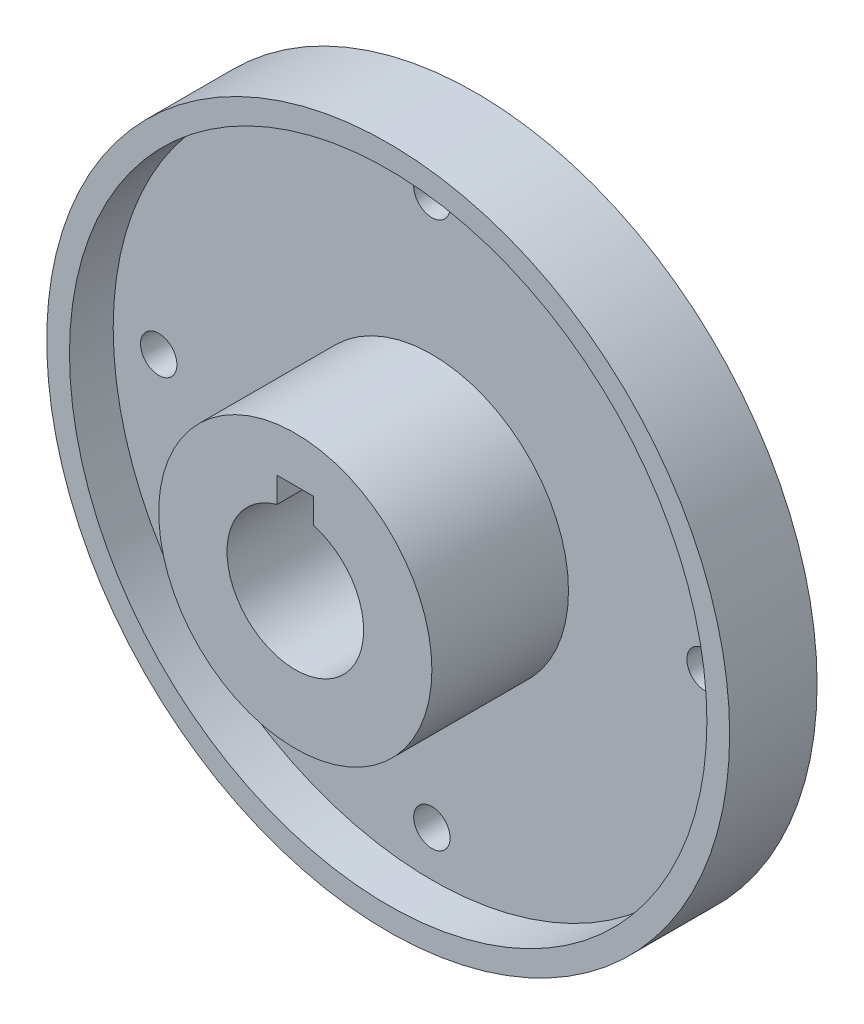
ISO-10303-21;
HEADER;
FILE_DESCRIPTION(('STEP AP214'),'2;1');
FILE_NAME('part.step','',(''),(''),'','','');
FILE_SCHEMA(('AUTOMOTIVE_DESIGN { 1 0 10303 214 1 1 1 1 }'));
ENDSEC;
DATA;
#1=APPLICATION_CONTEXT('core data for automotive mechanical design processes');
#2=APPLICATION_PROTOCOL_DEFINITION('international standard','automotive_design',2000,#1);
#3=PRODUCT_CONTEXT('',#1,'mechanical');
#4=PRODUCT('Part','Part','',(#3));
#5=PRODUCT_RELATED_PRODUCT_CATEGORY('part','',(#4));
#6=PRODUCT_DEFINITION_FORMATION('','',#4);
#7=PRODUCT_DEFINITION_CONTEXT('part definition',#1,'design');
#8=PRODUCT_DEFINITION('design','',#6,#7);
#9=PRODUCT_DEFINITION_SHAPE('','',#8);
#10=(LENGTH_UNIT() NAMED_UNIT(*) SI_UNIT(.MILLI.,.METRE.));
#11=(NAMED_UNIT(*) PLANE_ANGLE_UNIT() SI_UNIT($,.RADIAN.));
#12=(NAMED_UNIT(*) SI_UNIT($,.STERADIAN.) SOLID_ANGLE_UNIT());
#13=UNCERTAINTY_MEASURE_WITH_UNIT(LENGTH_MEASURE(1.E-05),#10,'distance_accuracy_value','');
#14=(GEOMETRIC_REPRESENTATION_CONTEXT(3) GLOBAL_UNCERTAINTY_ASSIGNED_CONTEXT((#13)) GLOBAL_UNIT_ASSIGNED_CONTEXT((#10,
#11,#12)) REPRESENTATION_CONTEXT('',''));
#15=CARTESIAN_POINT('',(0.,0.,0.));
#16=DIRECTION('',(0.,0.,1.));
#17=DIRECTION('',(1.,0.,0.));
#18=AXIS2_PLACEMENT_3D('',#15,#16,#17);
#19=CARTESIAN_POINT('',(0.,0.,19.2));
#20=DIRECTION('',(0.,0.,-1.));
#21=DIRECTION('',(-1.,0.,0.));
#22=AXIS2_PLACEMENT_3D('',#19,#20,#21);
#23=CYLINDRICAL_SURFACE('',#22,75.);
#24=CARTESIAN_POINT('',(0.,0.,19.2));
#25=DIRECTION('',(0.,0.,1.));
#26=DIRECTION('',(1.,0.,0.));
#27=AXIS2_PLACEMENT_3D('',#24,#25,#26);
#28=CIRCLE('',#27,75.);
#29=CARTESIAN_POINT('',(75.,0.,19.2));
#30=VERTEX_POINT('',#29);
#31=EDGE_CURVE('E175',#30,#30,#28,.T.);
#32=ORIENTED_EDGE('',*,*,#31,.F.);
#33=EDGE_LOOP('',(#32));
#34=FACE_BOUND('',#33,.T.);
#35=CARTESIAN_POINT('',(0.,0.,0.));
#36=DIRECTION('',(0.,0.,1.));
#37=DIRECTION('',(1.,0.,0.));
#38=AXIS2_PLACEMENT_3D('',#35,#36,#37);
#39=CIRCLE('',#38,75.);
#40=CARTESIAN_POINT('',(75.,0.,0.));
#41=VERTEX_POINT('',#40);
#42=EDGE_CURVE('E171',#41,#41,#39,.T.);
#43=ORIENTED_EDGE('',*,*,#42,.T.);
#44=EDGE_LOOP('',(#43));
#45=FACE_BOUND('',#44,.T.);
#46=ADVANCED_FACE('F45',(#34,#45),#23,.T.);
#47=CARTESIAN_POINT('',(0.,0.,19.2));
#48=DIRECTION('',(0.,0.,1.));
#49=DIRECTION('',(1.,0.,0.));
#50=AXIS2_PLACEMENT_3D('',#47,#48,#49);
#51=PLANE('',#50);
#52=CARTESIAN_POINT('',(0.,0.,19.2));
#53=DIRECTION('',(0.,0.,1.));
#54=DIRECTION('',(1.,0.,0.));
#55=AXIS2_PLACEMENT_3D('',#52,#53,#54);
#56=CIRCLE('',#55,70.);
#57=CARTESIAN_POINT('',(70.,0.,19.2));
#58=VERTEX_POINT('',#57);
#59=EDGE_CURVE('E163',#58,#58,#56,.T.);
#60=ORIENTED_EDGE('',*,*,#59,.F.);
#61=EDGE_LOOP('',(#60));
#62=FACE_BOUND('',#61,.T.);
#63=ORIENTED_EDGE('',*,*,#31,.T.);
#64=EDGE_LOOP('',(#63));
#65=FACE_BOUND('',#64,.T.);
#66=ADVANCED_FACE('F206',(#62,#65),#51,.T.);
#67=CARTESIAN_POINT('',(0.,0.,0.));
#68=DIRECTION('',(0.,0.,1.));
#69=DIRECTION('',(1.,0.,0.));
#70=AXIS2_PLACEMENT_3D('',#67,#68,#69);
#71=PLANE('',#70);
#72=CARTESIAN_POINT('',(0.,60.,0.));
#73=DIRECTION('',(0.,0.,1.));
#74=DIRECTION('',(1.,0.,0.));
#75=AXIS2_PLACEMENT_3D('',#72,#73,#74);
#76=CIRCLE('',#75,4.);
#77=CARTESIAN_POINT('',(4.,60.,0.));
#78=VERTEX_POINT('',#77);
#79=EDGE_CURVE('E146',#78,#78,#76,.T.);
#80=ORIENTED_EDGE('',*,*,#79,.T.);
#81=EDGE_LOOP('',(#80));
#82=FACE_BOUND('',#81,.T.);
#83=CARTESIAN_POINT('',(60.0000000000017,1.69428074463191E-12,0.));
#84=DIRECTION('',(0.,0.,1.));
#85=DIRECTION('',(1.,0.,0.));
#86=AXIS2_PLACEMENT_3D('',#83,#84,#85);
#87=CIRCLE('',#86,4.00000000000132);
#88=CARTESIAN_POINT('',(64.000000000003,1.69428074463191E-12,0.));
#89=VERTEX_POINT('',#88);
#90=EDGE_CURVE('E142',#89,#89,#87,.T.);
#91=ORIENTED_EDGE('',*,*,#90,.T.);
#92=EDGE_LOOP('',(#91));
#93=FACE_BOUND('',#92,.T.);
#94=CARTESIAN_POINT('',(3.38856148926383E-12,-60.,0.));
#95=DIRECTION('',(0.,0.,1.));
#96=DIRECTION('',(1.,0.,0.));
#97=AXIS2_PLACEMENT_3D('',#94,#95,#96);
#98=CIRCLE('',#97,4.00000000000364);
#99=CARTESIAN_POINT('',(4.00000000000703,-60.,0.));
#100=VERTEX_POINT('',#99);
#101=EDGE_CURVE('E138',#100,#100,#98,.T.);
#102=ORIENTED_EDGE('',*,*,#101,.T.);
#103=EDGE_LOOP('',(#102));
#104=FACE_BOUND('',#103,.T.);
#105=CARTESIAN_POINT('',(-59.9999999999983,-1.7016286254268E-12,0.));
#106=DIRECTION('',(0.,0.,1.));
#107=DIRECTION('',(1.,0.,0.));
#108=AXIS2_PLACEMENT_3D('',#105,#106,#107);
#109=CIRCLE('',#108,4.00000000000272);
#110=CARTESIAN_POINT('',(-55.9999999999956,-1.7016286254268E-12,0.));
#111=VERTEX_POINT('',#110);
#112=EDGE_CURVE('E123',#111,#111,#109,.T.);
#113=ORIENTED_EDGE('',*,*,#112,.T.);
#114=EDGE_LOOP('',(#113));
#115=FACE_BOUND('',#114,.T.);
#116=CARTESIAN_POINT('',(0.,0.,0.));
#117=DIRECTION('',(0.,0.,1.));
#118=DIRECTION('',(1.,0.,0.));
#119=AXIS2_PLACEMENT_3D('',#116,#117,#118);
#120=CIRCLE('',#119,15.);
#121=CARTESIAN_POINT('',(15.,0.,0.));
#122=VERTEX_POINT('',#121);
#123=EDGE_CURVE('E154',#122,#122,#120,.T.);
#124=ORIENTED_EDGE('',*,*,#123,.T.);
#125=EDGE_LOOP('',(#124));
#126=FACE_BOUND('',#125,.T.);
#127=ORIENTED_EDGE('',*,*,#42,.F.);
#128=EDGE_LOOP('',(#127));
#129=FACE_BOUND('',#128,.T.);
#130=ADVANCED_FACE('F211',(#82,#93,#104,#115,#126,#129),#71,.F.);
#131=CARTESIAN_POINT('',(0.,0.,9.6));
#132=DIRECTION('',(0.,0.,1.));
#133=DIRECTION('',(1.,0.,0.));
#134=AXIS2_PLACEMENT_3D('',#131,#132,#133);
#135=CYLINDRICAL_SURFACE('',#134,70.);
#136=CARTESIAN_POINT('',(0.,0.,9.6));
#137=DIRECTION('',(0.,0.,1.));
#138=DIRECTION('',(1.,0.,0.));
#139=AXIS2_PLACEMENT_3D('',#136,#137,#138);
#140=CIRCLE('',#139,70.);
#141=CARTESIAN_POINT('',(70.,0.,9.6));
#142=VERTEX_POINT('',#141);
#143=EDGE_CURVE('E167',#142,#142,#140,.T.);
#144=ORIENTED_EDGE('',*,*,#143,.F.);
#145=EDGE_LOOP('',(#144));
#146=FACE_BOUND('',#145,.T.);
#147=ORIENTED_EDGE('',*,*,#59,.T.);
#148=EDGE_LOOP('',(#147));
#149=FACE_BOUND('',#148,.T.);
#150=ADVANCED_FACE('F219',(#146,#149),#135,.F.);
#151=CARTESIAN_POINT('',(0.,0.,9.6));
#152=DIRECTION('',(0.,0.,1.));
#153=DIRECTION('',(1.,0.,0.));
#154=AXIS2_PLACEMENT_3D('',#151,#152,#153);
#155=PLANE('',#154);
#156=CARTESIAN_POINT('',(0.,60.,9.6));
#157=DIRECTION('',(0.,0.,1.));
#158=DIRECTION('',(1.,0.,0.));
#159=AXIS2_PLACEMENT_3D('',#156,#157,#158);
#160=CIRCLE('',#159,4.);
#161=CARTESIAN_POINT('',(4.,60.,9.6));
#162=VERTEX_POINT('',#161);
#163=EDGE_CURVE('E119',#162,#162,#160,.T.);
#164=ORIENTED_EDGE('',*,*,#163,.F.);
#165=EDGE_LOOP('',(#164));
#166=FACE_BOUND('',#165,.T.);
#167=CARTESIAN_POINT('',(60.0000000000017,1.69428074463191E-12,9.6));
#168=DIRECTION('',(0.,0.,1.));
#169=DIRECTION('',(1.,0.,0.));
#170=AXIS2_PLACEMENT_3D('',#167,#168,#169);
#171=CIRCLE('',#170,4.00000000000132);
#172=CARTESIAN_POINT('',(64.000000000003,1.69428074463191E-12,9.6));
#173=VERTEX_POINT('',#172);
#174=EDGE_CURVE('E124',#173,#173,#171,.T.);
#175=ORIENTED_EDGE('',*,*,#174,.F.);
#176=EDGE_LOOP('',(#175));
#177=FACE_BOUND('',#176,.T.);
#178=CARTESIAN_POINT('',(3.38856148926383E-12,-60.,9.6));
#179=DIRECTION('',(0.,0.,1.));
#180=DIRECTION('',(1.,0.,0.));
#181=AXIS2_PLACEMENT_3D('',#178,#179,#180);
#182=CIRCLE('',#181,4.00000000000364);
#183=CARTESIAN_POINT('',(4.00000000000703,-60.,9.6));
#184=VERTEX_POINT('',#183);
#185=EDGE_CURVE('E128',#184,#184,#182,.T.);
#186=ORIENTED_EDGE('',*,*,#185,.F.);
#187=EDGE_LOOP('',(#186));
#188=FACE_BOUND('',#187,.T.);
#189=CARTESIAN_POINT('',(-59.9999999999983,-1.7016286254268E-12,9.6));
#190=DIRECTION('',(0.,0.,1.));
#191=DIRECTION('',(1.,0.,0.));
#192=AXIS2_PLACEMENT_3D('',#189,#190,#191);
#193=CIRCLE('',#192,4.00000000000272);
#194=CARTESIAN_POINT('',(-55.9999999999956,-1.7016286254268E-12,9.6));
#195=VERTEX_POINT('',#194);
#196=EDGE_CURVE('E117',#195,#195,#193,.T.);
#197=ORIENTED_EDGE('',*,*,#196,.F.);
#198=EDGE_LOOP('',(#197));
#199=FACE_BOUND('',#198,.T.);
#200=CARTESIAN_POINT('',(0.,0.,9.6));
#201=DIRECTION('',(0.,0.,1.));
#202=DIRECTION('',(1.,0.,0.));
#203=AXIS2_PLACEMENT_3D('',#200,#201,#202);
#204=CIRCLE('',#203,30.);
#205=CARTESIAN_POINT('',(30.,0.,9.6));
#206=VERTEX_POINT('',#205);
#207=EDGE_CURVE('E158',#206,#206,#204,.T.);
#208=ORIENTED_EDGE('',*,*,#207,.F.);
#209=EDGE_LOOP('',(#208));
#210=FACE_BOUND('',#209,.T.);
#211=ORIENTED_EDGE('',*,*,#143,.T.);
#212=EDGE_LOOP('',(#211));
#213=FACE_BOUND('',#212,.T.);
#214=ADVANCED_FACE('F226',(#166,#177,#188,#199,#210,#213),#155,.T.);
#215=CARTESIAN_POINT('',(0.,0.,39.6));
#216=DIRECTION('',(0.,0.,-1.));
#217=DIRECTION('',(-1.,0.,0.));
#218=AXIS2_PLACEMENT_3D('',#215,#216,#217);
#219=CYLINDRICAL_SURFACE('',#218,30.);
#220=CARTESIAN_POINT('',(0.,0.,39.6));
#221=DIRECTION('',(0.,0.,1.));
#222=DIRECTION('',(1.,0.,0.));
#223=AXIS2_PLACEMENT_3D('',#220,#221,#222);
#224=CIRCLE('',#223,30.);
#225=CARTESIAN_POINT('',(30.,0.,39.6));
#226=VERTEX_POINT('',#225);
#227=EDGE_CURVE('E159',#226,#226,#224,.T.);
#228=ORIENTED_EDGE('',*,*,#227,.F.);
#229=EDGE_LOOP('',(#228));
#230=FACE_BOUND('',#229,.T.);
#231=ORIENTED_EDGE('',*,*,#207,.T.);
#232=EDGE_LOOP('',(#231));
#233=FACE_BOUND('',#232,.T.);
#234=ADVANCED_FACE('F232',(#230,#233),#219,.T.);
#235=CARTESIAN_POINT('',(0.,0.,39.6));
#236=DIRECTION('',(0.,0.,1.));
#237=DIRECTION('',(1.,0.,0.));
#238=AXIS2_PLACEMENT_3D('',#235,#236,#237);
#239=PLANE('',#238);
#240=DIRECTION('',(0.,1.,0.));
#241=VECTOR('',#240,1.);
#242=CARTESIAN_POINT('',(4.,20.,39.6));
#243=LINE('',#242,#241);
#244=CARTESIAN_POINT('',(4.,14.456832294801,39.6));
#245=VERTEX_POINT('',#244);
#246=CARTESIAN_POINT('',(4.,20.,39.6));
#247=VERTEX_POINT('',#246);
#248=EDGE_CURVE('E96',#245,#247,#243,.T.);
#249=ORIENTED_EDGE('',*,*,#248,.F.);
#250=CARTESIAN_POINT('',(0.,0.,39.6));
#251=DIRECTION('',(0.,0.,1.));
#252=DIRECTION('',(1.,0.,0.));
#253=AXIS2_PLACEMENT_3D('',#250,#251,#252);
#254=CIRCLE('',#253,15.);
#255=CARTESIAN_POINT('',(-4.,14.456832294801,39.6));
#256=VERTEX_POINT('',#255);
#257=EDGE_CURVE('E150',#256,#245,#254,.T.);
#258=ORIENTED_EDGE('',*,*,#257,.F.);
#259=DIRECTION('',(0.,-1.,0.));
#260=VECTOR('',#259,1.);
#261=CARTESIAN_POINT('',(-4.,20.,39.6));
#262=LINE('',#261,#260);
#263=CARTESIAN_POINT('',(-4.,20.,39.6));
#264=VERTEX_POINT('',#263);
#265=EDGE_CURVE('E90',#264,#256,#262,.T.);
#266=ORIENTED_EDGE('',*,*,#265,.F.);
#267=DIRECTION('',(-1.,0.,0.));
#268=VECTOR('',#267,1.);
#269=CARTESIAN_POINT('',(-4.,20.,39.6));
#270=LINE('',#269,#268);
#271=EDGE_CURVE('E111',#247,#264,#270,.T.);
#272=ORIENTED_EDGE('',*,*,#271,.F.);
#273=EDGE_LOOP('',(#249,#258,#266,#272));
#274=FACE_BOUND('',#273,.T.);
#275=ORIENTED_EDGE('',*,*,#227,.T.);
#276=EDGE_LOOP('',(#275));
#277=FACE_BOUND('',#276,.T.);
#278=ADVANCED_FACE('F192',(#274,#277),#239,.T.);
#279=CARTESIAN_POINT('',(0.,0.,-17.4));
#280=DIRECTION('',(0.,0.,1.));
#281=DIRECTION('',(1.,0.,0.));
#282=AXIS2_PLACEMENT_3D('',#279,#280,#281);
#283=CYLINDRICAL_SURFACE('',#282,15.);
#284=ORIENTED_EDGE('',*,*,#257,.T.);
#285=DIRECTION('',(0.,0.,1.));
#286=VECTOR('',#285,1.);
#287=CARTESIAN_POINT('',(4.,14.456832294801,-17.4));
#288=LINE('',#287,#286);
#289=CARTESIAN_POINT('',(4.,14.456832294801,9.6));
#290=VERTEX_POINT('',#289);
#291=EDGE_CURVE('E11',#245,#290,#288,.F.);
#292=ORIENTED_EDGE('',*,*,#291,.T.);
#293=CARTESIAN_POINT('',(0.,0.,9.6));
#294=DIRECTION('',(0.,0.,1.));
#295=DIRECTION('',(1.,0.,0.));
#296=AXIS2_PLACEMENT_3D('',#293,#294,#295);
#297=CIRCLE('',#296,15.);
#298=CARTESIAN_POINT('',(-4.,14.456832294801,9.6));
#299=VERTEX_POINT('',#298);
#300=EDGE_CURVE('E65',#299,#290,#297,.F.);
#301=ORIENTED_EDGE('',*,*,#300,.F.);
#302=DIRECTION('',(0.,0.,1.));
#303=VECTOR('',#302,1.);
#304=CARTESIAN_POINT('',(-4.,14.456832294801,-17.4));
#305=LINE('',#304,#303);
#306=EDGE_CURVE('E53',#299,#256,#305,.T.);
#307=ORIENTED_EDGE('',*,*,#306,.T.);
#308=EDGE_LOOP('',(#284,#292,#301,#307));
#309=FACE_BOUND('',#308,.T.);
#310=ORIENTED_EDGE('',*,*,#123,.F.);
#311=EDGE_LOOP('',(#310));
#312=FACE_BOUND('',#311,.T.);
#313=ADVANCED_FACE('F187',(#309,#312),#283,.F.);
#314=CARTESIAN_POINT('',(-59.9999999999983,-1.7016286254268E-12,-47.4));
#315=DIRECTION('',(0.,0.,1.));
#316=DIRECTION('',(1.,0.,0.));
#317=AXIS2_PLACEMENT_3D('',#314,#315,#316);
#318=CYLINDRICAL_SURFACE('',#317,4.00000000000272);
#319=ORIENTED_EDGE('',*,*,#196,.T.);
#320=EDGE_LOOP('',(#319));
#321=FACE_BOUND('',#320,.T.);
#322=ORIENTED_EDGE('',*,*,#112,.F.);
#323=EDGE_LOOP('',(#322));
#324=FACE_BOUND('',#323,.T.);
#325=ADVANCED_FACE('F240',(#321,#324),#318,.F.);
#326=CARTESIAN_POINT('',(3.38856148926383E-12,-60.,-47.4));
#327=DIRECTION('',(0.,0.,1.));
#328=DIRECTION('',(1.,0.,0.));
#329=AXIS2_PLACEMENT_3D('',#326,#327,#328);
#330=CYLINDRICAL_SURFACE('',#329,4.00000000000364);
#331=ORIENTED_EDGE('',*,*,#185,.T.);
#332=EDGE_LOOP('',(#331));
#333=FACE_BOUND('',#332,.T.);
#334=ORIENTED_EDGE('',*,*,#101,.F.);
#335=EDGE_LOOP('',(#334));
#336=FACE_BOUND('',#335,.T.);
#337=ADVANCED_FACE('F243',(#333,#336),#330,.F.);
#338=CARTESIAN_POINT('',(60.0000000000017,1.69428074463191E-12,-47.4));
#339=DIRECTION('',(0.,0.,1.));
#340=DIRECTION('',(1.,0.,0.));
#341=AXIS2_PLACEMENT_3D('',#338,#339,#340);
#342=CYLINDRICAL_SURFACE('',#341,4.00000000000132);
#343=ORIENTED_EDGE('',*,*,#174,.T.);
#344=EDGE_LOOP('',(#343));
#345=FACE_BOUND('',#344,.T.);
#346=ORIENTED_EDGE('',*,*,#90,.F.);
#347=EDGE_LOOP('',(#346));
#348=FACE_BOUND('',#347,.T.);
#349=ADVANCED_FACE('F247',(#345,#348),#342,.F.);
#350=CARTESIAN_POINT('',(0.,60.,-47.4));
#351=DIRECTION('',(0.,0.,1.));
#352=DIRECTION('',(1.,0.,0.));
#353=AXIS2_PLACEMENT_3D('',#350,#351,#352);
#354=CYLINDRICAL_SURFACE('',#353,4.);
#355=ORIENTED_EDGE('',*,*,#163,.T.);
#356=EDGE_LOOP('',(#355));
#357=FACE_BOUND('',#356,.T.);
#358=ORIENTED_EDGE('',*,*,#79,.F.);
#359=EDGE_LOOP('',(#358));
#360=FACE_BOUND('',#359,.T.);
#361=ADVANCED_FACE('F202',(#357,#360),#354,.F.);
#362=CARTESIAN_POINT('',(4.,20.,9.6));
#363=DIRECTION('',(1.,0.,0.));
#364=DIRECTION('',(0.,1.,0.));
#365=AXIS2_PLACEMENT_3D('',#362,#363,#364);
#366=PLANE('',#365);
#367=ORIENTED_EDGE('',*,*,#248,.T.);
#368=DIRECTION('',(0.,0.,1.));
#369=VECTOR('',#368,1.);
#370=CARTESIAN_POINT('',(4.,20.,9.6));
#371=LINE('',#370,#369);
#372=CARTESIAN_POINT('',(4.,20.,9.6));
#373=VERTEX_POINT('',#372);
#374=EDGE_CURVE('E93',#373,#247,#371,.T.);
#375=ORIENTED_EDGE('',*,*,#374,.F.);
#376=DIRECTION('',(0.,1.,0.));
#377=VECTOR('',#376,1.);
#378=CARTESIAN_POINT('',(4.,20.,9.6));
#379=LINE('',#378,#377);
#380=EDGE_CURVE('E83',#290,#373,#379,.T.);
#381=ORIENTED_EDGE('',*,*,#380,.F.);
#382=ORIENTED_EDGE('',*,*,#291,.F.);
#383=EDGE_LOOP('',(#367,#375,#381,#382));
#384=FACE_BOUND('',#383,.T.);
#385=ADVANCED_FACE('F94',(#384),#366,.F.);
#386=CARTESIAN_POINT('',(-4.,20.,9.6));
#387=DIRECTION('',(-1.,0.,0.));
#388=DIRECTION('',(0.,-1.,0.));
#389=AXIS2_PLACEMENT_3D('',#386,#387,#388);
#390=PLANE('',#389);
#391=DIRECTION('',(0.,-1.,0.));
#392=VECTOR('',#391,1.);
#393=CARTESIAN_POINT('',(-4.,20.,9.6));
#394=LINE('',#393,#392);
#395=CARTESIAN_POINT('',(-4.,20.,9.6));
#396=VERTEX_POINT('',#395);
#397=EDGE_CURVE('E60',#396,#299,#394,.T.);
#398=ORIENTED_EDGE('',*,*,#397,.F.);
#399=DIRECTION('',(0.,0.,1.));
#400=VECTOR('',#399,1.);
#401=CARTESIAN_POINT('',(-4.,20.,9.6));
#402=LINE('',#401,#400);
#403=EDGE_CURVE('E101',#396,#264,#402,.T.);
#404=ORIENTED_EDGE('',*,*,#403,.T.);
#405=ORIENTED_EDGE('',*,*,#265,.T.);
#406=ORIENTED_EDGE('',*,*,#306,.F.);
#407=EDGE_LOOP('',(#398,#404,#405,#406));
#408=FACE_BOUND('',#407,.T.);
#409=ADVANCED_FACE('F194',(#408),#390,.F.);
#410=CARTESIAN_POINT('',(0.,0.,9.6));
#411=DIRECTION('',(0.,0.,1.));
#412=DIRECTION('',(1.,0.,0.));
#413=AXIS2_PLACEMENT_3D('',#410,#411,#412);
#414=PLANE('',#413);
#415=ORIENTED_EDGE('',*,*,#300,.T.);
#416=ORIENTED_EDGE('',*,*,#380,.T.);
#417=DIRECTION('',(-1.,0.,0.));
#418=VECTOR('',#417,1.);
#419=CARTESIAN_POINT('',(-4.,20.,9.6));
#420=LINE('',#419,#418);
#421=EDGE_CURVE('E87',#373,#396,#420,.T.);
#422=ORIENTED_EDGE('',*,*,#421,.T.);
#423=ORIENTED_EDGE('',*,*,#397,.T.);
#424=EDGE_LOOP('',(#415,#416,#422,#423));
#425=FACE_BOUND('',#424,.T.);
#426=ADVANCED_FACE('F85',(#425),#414,.T.);
#427=CARTESIAN_POINT('',(-4.,20.,9.6));
#428=DIRECTION('',(0.,1.,0.));
#429=DIRECTION('',(0.,0.,1.));
#430=AXIS2_PLACEMENT_3D('',#427,#428,#429);
#431=PLANE('',#430);
#432=ORIENTED_EDGE('',*,*,#271,.T.);
#433=ORIENTED_EDGE('',*,*,#403,.F.);
#434=ORIENTED_EDGE('',*,*,#421,.F.);
#435=ORIENTED_EDGE('',*,*,#374,.T.);
#436=EDGE_LOOP('',(#432,#433,#434,#435));
#437=FACE_BOUND('',#436,.T.);
#438=ADVANCED_FACE('F103',(#437),#431,.F.);
#439=CLOSED_SHELL('',(#46,#66,#130,#150,#214,#234,#278,#313,#325,#337,#349,#361,#385,#409,#426,#438));
#440=MANIFOLD_SOLID_BREP('B2',#439);
#441=ADVANCED_BREP_SHAPE_REPRESENTATION('',(#18,#440),#14);
#442=SHAPE_DEFINITION_REPRESENTATION(#9,#441);
ENDSEC;
END-ISO-10303-21;
